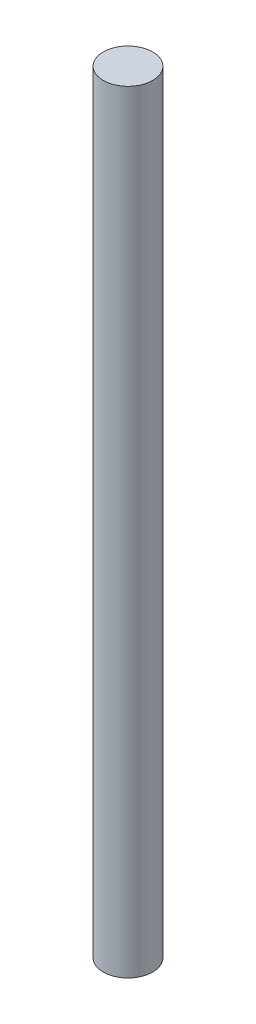
ISO-10303-21;
HEADER;
FILE_DESCRIPTION(('STEP AP214'),'2;1');
FILE_NAME('part.step','',(''),(''),'','','');
FILE_SCHEMA(('AUTOMOTIVE_DESIGN { 1 0 10303 214 1 1 1 1 }'));
ENDSEC;
DATA;
#1=APPLICATION_CONTEXT('core data for automotive mechanical design processes');
#2=APPLICATION_PROTOCOL_DEFINITION('international standard','automotive_design',2000,#1);
#3=PRODUCT_CONTEXT('',#1,'mechanical');
#4=PRODUCT('Part','Part','',(#3));
#5=PRODUCT_RELATED_PRODUCT_CATEGORY('part','',(#4));
#6=PRODUCT_DEFINITION_FORMATION('','',#4);
#7=PRODUCT_DEFINITION_CONTEXT('part definition',#1,'design');
#8=PRODUCT_DEFINITION('design','',#6,#7);
#9=PRODUCT_DEFINITION_SHAPE('','',#8);
#10=(LENGTH_UNIT() NAMED_UNIT(*) SI_UNIT(.MILLI.,.METRE.));
#11=(NAMED_UNIT(*) PLANE_ANGLE_UNIT() SI_UNIT($,.RADIAN.));
#12=(NAMED_UNIT(*) SI_UNIT($,.STERADIAN.) SOLID_ANGLE_UNIT());
#13=UNCERTAINTY_MEASURE_WITH_UNIT(LENGTH_MEASURE(1.E-05),#10,'distance_accuracy_value','');
#14=(GEOMETRIC_REPRESENTATION_CONTEXT(3) GLOBAL_UNCERTAINTY_ASSIGNED_CONTEXT((#13)) GLOBAL_UNIT_ASSIGNED_CONTEXT((#10,
#11,#12)) REPRESENTATION_CONTEXT('',''));
#15=CARTESIAN_POINT('',(0.,0.,0.));
#16=DIRECTION('',(0.,0.,1.));
#17=DIRECTION('',(1.,0.,0.));
#18=AXIS2_PLACEMENT_3D('',#15,#16,#17);
#19=CARTESIAN_POINT('',(0.,125.,0.));
#20=DIRECTION('',(0.,-1.,0.));
#21=DIRECTION('',(0.,0.,-1.));
#22=AXIS2_PLACEMENT_3D('',#19,#20,#21);
#23=CYLINDRICAL_SURFACE('',#22,4.);
#24=CARTESIAN_POINT('',(0.,125.,0.));
#25=DIRECTION('',(0.,1.,0.));
#26=DIRECTION('',(0.,0.,1.));
#27=AXIS2_PLACEMENT_3D('',#24,#25,#26);
#28=CIRCLE('',#27,4.);
#29=CARTESIAN_POINT('',(0.,125.,4.));
#30=VERTEX_POINT('',#29);
#31=EDGE_CURVE('E10',#30,#30,#28,.T.);
#32=ORIENTED_EDGE('',*,*,#31,.F.);
#33=EDGE_LOOP('',(#32));
#34=FACE_BOUND('',#33,.T.);
#35=CARTESIAN_POINT('',(0.,0.,0.));
#36=DIRECTION('',(0.,1.,0.));
#37=DIRECTION('',(0.,0.,1.));
#38=AXIS2_PLACEMENT_3D('',#35,#36,#37);
#39=CIRCLE('',#38,4.);
#40=CARTESIAN_POINT('',(0.,0.,4.));
#41=VERTEX_POINT('',#40);
#42=EDGE_CURVE('E42',#41,#41,#39,.T.);
#43=ORIENTED_EDGE('',*,*,#42,.T.);
#44=EDGE_LOOP('',(#43));
#45=FACE_BOUND('',#44,.T.);
#46=ADVANCED_FACE('F39',(#34,#45),#23,.T.);
#47=CARTESIAN_POINT('',(0.,125.,0.));
#48=DIRECTION('',(0.,1.,0.));
#49=DIRECTION('',(0.,0.,1.));
#50=AXIS2_PLACEMENT_3D('',#47,#48,#49);
#51=PLANE('',#50);
#52=ORIENTED_EDGE('',*,*,#31,.T.);
#53=EDGE_LOOP('',(#52));
#54=FACE_BOUND('',#53,.T.);
#55=ADVANCED_FACE('F56',(#54),#51,.T.);
#56=CARTESIAN_POINT('',(0.,0.,0.));
#57=DIRECTION('',(0.,1.,0.));
#58=DIRECTION('',(0.,0.,1.));
#59=AXIS2_PLACEMENT_3D('',#56,#57,#58);
#60=PLANE('',#59);
#61=ORIENTED_EDGE('',*,*,#42,.F.);
#62=EDGE_LOOP('',(#61));
#63=FACE_BOUND('',#62,.T.);
#64=ADVANCED_FACE('F54',(#63),#60,.F.);
#65=CLOSED_SHELL('',(#46,#55,#64));
#66=MANIFOLD_SOLID_BREP('B2',#65);
#67=ADVANCED_BREP_SHAPE_REPRESENTATION('',(#18,#66),#14);
#68=SHAPE_DEFINITION_REPRESENTATION(#9,#67);
ENDSEC;
END-ISO-10303-21;
